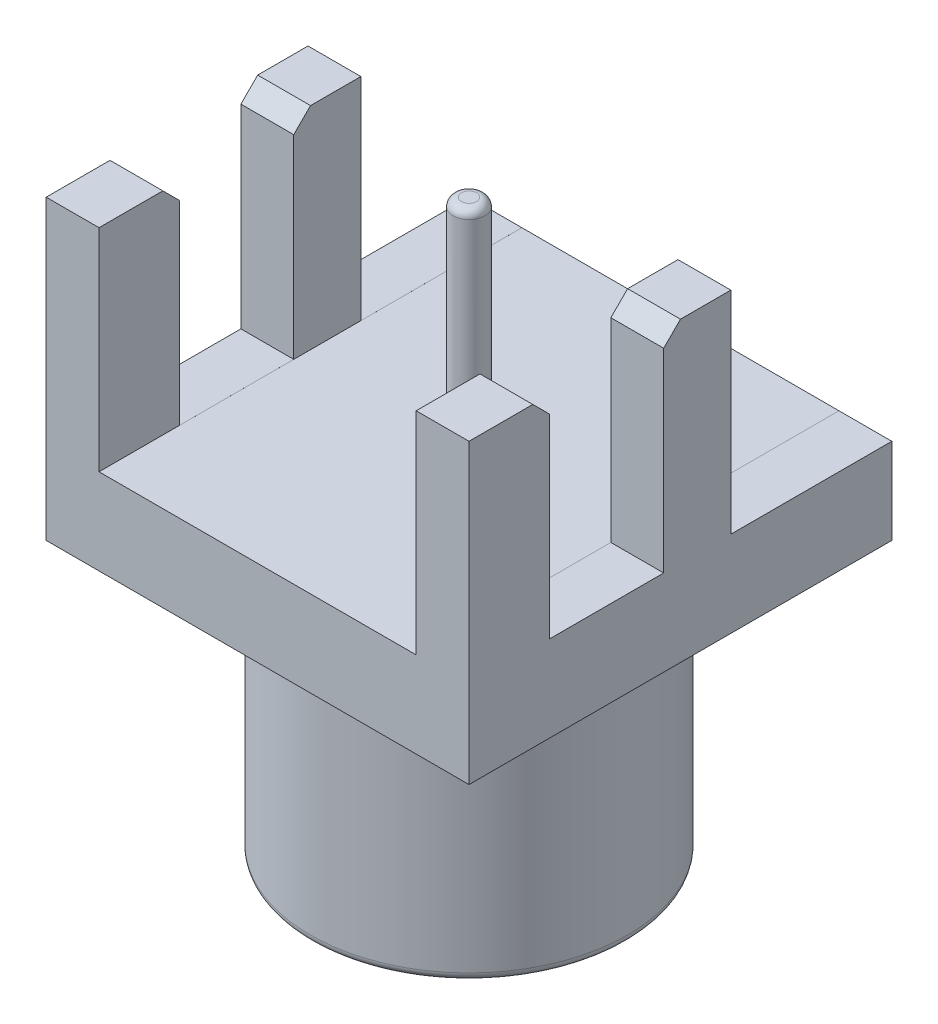
ISO-10303-21;
HEADER;
FILE_DESCRIPTION(('STEP AP214'),'2;1');
FILE_NAME('part.step','',(''),(''),'','','');
FILE_SCHEMA(('AUTOMOTIVE_DESIGN { 1 0 10303 214 1 1 1 1 }'));
ENDSEC;
DATA;
#1=APPLICATION_CONTEXT('core data for automotive mechanical design processes');
#2=APPLICATION_PROTOCOL_DEFINITION('international standard','automotive_design',2000,#1);
#3=PRODUCT_CONTEXT('',#1,'mechanical');
#4=PRODUCT('Part','Part','',(#3));
#5=PRODUCT_RELATED_PRODUCT_CATEGORY('part','',(#4));
#6=PRODUCT_DEFINITION_FORMATION('','',#4);
#7=PRODUCT_DEFINITION_CONTEXT('part definition',#1,'design');
#8=PRODUCT_DEFINITION('design','',#6,#7);
#9=PRODUCT_DEFINITION_SHAPE('','',#8);
#10=(LENGTH_UNIT() NAMED_UNIT(*) SI_UNIT(.MILLI.,.METRE.));
#11=(NAMED_UNIT(*) PLANE_ANGLE_UNIT() SI_UNIT($,.RADIAN.));
#12=(NAMED_UNIT(*) SI_UNIT($,.STERADIAN.) SOLID_ANGLE_UNIT());
#13=UNCERTAINTY_MEASURE_WITH_UNIT(LENGTH_MEASURE(1.E-05),#10,'distance_accuracy_value','');
#14=(GEOMETRIC_REPRESENTATION_CONTEXT(3) GLOBAL_UNCERTAINTY_ASSIGNED_CONTEXT((#13)) GLOBAL_UNIT_ASSIGNED_CONTEXT((#10,
#11,#12)) REPRESENTATION_CONTEXT('',''));
#15=CARTESIAN_POINT('',(0.,0.,0.));
#16=DIRECTION('',(0.,0.,1.));
#17=DIRECTION('',(1.,0.,0.));
#18=AXIS2_PLACEMENT_3D('',#15,#16,#17);
#19=CARTESIAN_POINT('',(0.,-4.1,0.));
#20=DIRECTION('',(0.,1.,0.));
#21=DIRECTION('',(0.,0.,1.));
#22=AXIS2_PLACEMENT_3D('',#19,#20,#21);
#23=CYLINDRICAL_SURFACE('',#22,0.381);
#24=CARTESIAN_POINT('',(0.,0.,0.));
#25=DIRECTION('',(0.,-1.,0.));
#26=DIRECTION('',(0.,0.,-1.));
#27=AXIS2_PLACEMENT_3D('',#24,#25,#26);
#28=CIRCLE('',#27,0.381);
#29=CARTESIAN_POINT('',(0.,0.,-0.381));
#30=VERTEX_POINT('',#29);
#31=EDGE_CURVE('E790',#30,#30,#28,.T.);
#32=ORIENTED_EDGE('',*,*,#31,.T.);
#33=EDGE_LOOP('',(#32));
#34=FACE_BOUND('',#33,.T.);
#35=CARTESIAN_POINT('',(0.,-2.576,0.));
#36=DIRECTION('',(0.,-1.,0.));
#37=DIRECTION('',(0.,0.,-1.));
#38=AXIS2_PLACEMENT_3D('',#35,#36,#37);
#39=CIRCLE('',#38,0.381);
#40=CARTESIAN_POINT('',(0.,-2.576,-0.381));
#41=VERTEX_POINT('',#40);
#42=EDGE_CURVE('E789',#41,#41,#39,.T.);
#43=ORIENTED_EDGE('',*,*,#42,.F.);
#44=EDGE_LOOP('',(#43));
#45=FACE_BOUND('',#44,.T.);
#46=ADVANCED_FACE('F41',(#34,#45),#23,.T.);
#47=CARTESIAN_POINT('',(0.,1.3001,0.));
#48=DIRECTION('',(0.,-1.,0.));
#49=DIRECTION('',(0.,0.,-1.));
#50=AXIS2_PLACEMENT_3D('',#47,#48,#49);
#51=PLANE('',#50);
#52=DIRECTION('',(-1.,0.,0.));
#53=VECTOR('',#52,1.);
#54=CARTESIAN_POINT('',(3.2,1.3001,1.98));
#55=LINE('',#54,#53);
#56=CARTESIAN_POINT('',(3.2,1.3001,1.98));
#57=VERTEX_POINT('',#56);
#58=CARTESIAN_POINT('',(2.4,1.3001,1.98));
#59=VERTEX_POINT('',#58);
#60=EDGE_CURVE('E230',#57,#59,#55,.T.);
#61=ORIENTED_EDGE('',*,*,#60,.F.);
#62=DIRECTION('',(0.,0.,-1.));
#63=VECTOR('',#62,1.);
#64=CARTESIAN_POINT('',(3.2,1.3001,-3.2));
#65=LINE('',#64,#63);
#66=CARTESIAN_POINT('',(3.2,1.3001,0.252799999999999));
#67=VERTEX_POINT('',#66);
#68=EDGE_CURVE('E307',#57,#67,#65,.T.);
#69=ORIENTED_EDGE('',*,*,#68,.T.);
#70=DIRECTION('',(1.,0.,0.));
#71=VECTOR('',#70,1.);
#72=CARTESIAN_POINT('',(3.2,1.3001,0.252799999999999));
#73=LINE('',#72,#71);
#74=CARTESIAN_POINT('',(2.4,1.3001,0.252799999999998));
#75=VERTEX_POINT('',#74);
#76=EDGE_CURVE('E249',#75,#67,#73,.T.);
#77=ORIENTED_EDGE('',*,*,#76,.F.);
#78=DIRECTION('',(0.,0.,1.));
#79=VECTOR('',#78,1.);
#80=CARTESIAN_POINT('',(2.4,1.3001,-3.2));
#81=LINE('',#80,#79);
#82=EDGE_CURVE('E313',#75,#59,#81,.T.);
#83=ORIENTED_EDGE('',*,*,#82,.T.);
#84=EDGE_LOOP('',(#61,#69,#77,#83));
#85=FACE_BOUND('',#84,.T.);
#86=ADVANCED_FACE('F422',(#85),#51,.F.);
#87=DIRECTION('',(-1.,0.,0.));
#88=VECTOR('',#87,1.);
#89=CARTESIAN_POINT('',(3.2,1.3001,-0.763200000000001));
#90=LINE('',#89,#88);
#91=CARTESIAN_POINT('',(3.2,1.3001,-0.763200000000001));
#92=VERTEX_POINT('',#91);
#93=CARTESIAN_POINT('',(2.4,1.3001,-0.763200000000001));
#94=VERTEX_POINT('',#93);
#95=EDGE_CURVE('E244',#92,#94,#90,.T.);
#96=ORIENTED_EDGE('',*,*,#95,.F.);
#97=CARTESIAN_POINT('',(3.2,1.3001,-3.2));
#98=VERTEX_POINT('',#97);
#99=EDGE_CURVE('E311',#92,#98,#65,.T.);
#100=ORIENTED_EDGE('',*,*,#99,.T.);
#101=DIRECTION('',(-1.,0.,0.));
#102=VECTOR('',#101,1.);
#103=CARTESIAN_POINT('',(3.2,1.3001,-3.2));
#104=LINE('',#103,#102);
#105=CARTESIAN_POINT('',(2.4,1.3001,-3.2));
#106=VERTEX_POINT('',#105);
#107=EDGE_CURVE('E310',#98,#106,#104,.T.);
#108=ORIENTED_EDGE('',*,*,#107,.T.);
#109=EDGE_CURVE('E314',#106,#94,#81,.T.);
#110=ORIENTED_EDGE('',*,*,#109,.T.);
#111=EDGE_LOOP('',(#96,#100,#108,#110));
#112=FACE_BOUND('',#111,.T.);
#113=ADVANCED_FACE('F428',(#112),#51,.F.);
#114=CARTESIAN_POINT('',(0.,1.3001,0.));
#115=DIRECTION('',(0.,1.,0.));
#116=DIRECTION('',(0.,0.,1.));
#117=AXIS2_PLACEMENT_3D('',#114,#115,#116);
#118=PLANE('',#117);
#119=DIRECTION('',(0.,0.,-1.));
#120=VECTOR('',#119,1.);
#121=CARTESIAN_POINT('',(-2.4,1.3001,-3.2));
#122=LINE('',#121,#120);
#123=CARTESIAN_POINT('',(-2.4,1.3001,1.98));
#124=VERTEX_POINT('',#123);
#125=CARTESIAN_POINT('',(-2.4,1.3001,0.2528));
#126=VERTEX_POINT('',#125);
#127=EDGE_CURVE('E328',#124,#126,#122,.T.);
#128=ORIENTED_EDGE('',*,*,#127,.T.);
#129=DIRECTION('',(1.,0.,0.));
#130=VECTOR('',#129,1.);
#131=CARTESIAN_POINT('',(-3.2,1.3001,0.2528));
#132=LINE('',#131,#130);
#133=CARTESIAN_POINT('',(-3.2,1.3001,0.2528));
#134=VERTEX_POINT('',#133);
#135=EDGE_CURVE('E268',#134,#126,#132,.T.);
#136=ORIENTED_EDGE('',*,*,#135,.F.);
#137=DIRECTION('',(0.,0.,1.));
#138=VECTOR('',#137,1.);
#139=CARTESIAN_POINT('',(-3.2,1.3001,-3.2));
#140=LINE('',#139,#138);
#141=CARTESIAN_POINT('',(-3.2,1.3001,1.98));
#142=VERTEX_POINT('',#141);
#143=EDGE_CURVE('E327',#134,#142,#140,.T.);
#144=ORIENTED_EDGE('',*,*,#143,.T.);
#145=DIRECTION('',(-1.,0.,0.));
#146=VECTOR('',#145,1.);
#147=CARTESIAN_POINT('',(-3.2,1.3001,1.98));
#148=LINE('',#147,#146);
#149=EDGE_CURVE('E291',#124,#142,#148,.T.);
#150=ORIENTED_EDGE('',*,*,#149,.F.);
#151=EDGE_LOOP('',(#128,#136,#144,#150));
#152=FACE_BOUND('',#151,.T.);
#153=ADVANCED_FACE('F499',(#152),#118,.T.);
#154=CARTESIAN_POINT('',(-3.2,1.3001,-3.2));
#155=VERTEX_POINT('',#154);
#156=CARTESIAN_POINT('',(-3.2,1.3001,-0.7632));
#157=VERTEX_POINT('',#156);
#158=EDGE_CURVE('E324',#155,#157,#140,.T.);
#159=ORIENTED_EDGE('',*,*,#158,.T.);
#160=DIRECTION('',(-1.,0.,0.));
#161=VECTOR('',#160,1.);
#162=CARTESIAN_POINT('',(-3.2,1.3001,-0.7632));
#163=LINE('',#162,#161);
#164=CARTESIAN_POINT('',(-2.4,1.3001,-0.7632));
#165=VERTEX_POINT('',#164);
#166=EDGE_CURVE('E273',#165,#157,#163,.T.);
#167=ORIENTED_EDGE('',*,*,#166,.F.);
#168=CARTESIAN_POINT('',(-2.4,1.3001,-3.2));
#169=VERTEX_POINT('',#168);
#170=EDGE_CURVE('E326',#165,#169,#122,.T.);
#171=ORIENTED_EDGE('',*,*,#170,.T.);
#172=DIRECTION('',(-1.,0.,0.));
#173=VECTOR('',#172,1.);
#174=CARTESIAN_POINT('',(-3.2,1.3001,-3.2));
#175=LINE('',#174,#173);
#176=EDGE_CURVE('E331',#169,#155,#175,.T.);
#177=ORIENTED_EDGE('',*,*,#176,.T.);
#178=EDGE_LOOP('',(#159,#167,#171,#177));
#179=FACE_BOUND('',#178,.T.);
#180=ADVANCED_FACE('F507',(#179),#118,.T.);
#181=CARTESIAN_POINT('',(0.,1.3,0.));
#182=DIRECTION('',(0.,-1.,0.));
#183=DIRECTION('',(0.,0.,-1.));
#184=AXIS2_PLACEMENT_3D('',#181,#182,#183);
#185=PLANE('',#184);
#186=CARTESIAN_POINT('',(0.,1.3,0.));
#187=DIRECTION('',(0.,-1.,0.));
#188=DIRECTION('',(0.,0.,-1.));
#189=AXIS2_PLACEMENT_3D('',#186,#187,#188);
#190=CIRCLE('',#189,0.24);
#191=CARTESIAN_POINT('',(0.,1.3,-0.24));
#192=VERTEX_POINT('',#191);
#193=EDGE_CURVE('E389',#192,#192,#190,.F.);
#194=ORIENTED_EDGE('',*,*,#193,.F.);
#195=EDGE_LOOP('',(#194));
#196=FACE_BOUND('',#195,.T.);
#197=DIRECTION('',(0.,0.,1.));
#198=VECTOR('',#197,1.);
#199=CARTESIAN_POINT('',(2.4,1.3,-3.2));
#200=LINE('',#199,#198);
#201=CARTESIAN_POINT('',(2.4,1.3,-3.2));
#202=VERTEX_POINT('',#201);
#203=CARTESIAN_POINT('',(2.4,1.3,3.2));
#204=VERTEX_POINT('',#203);
#205=EDGE_CURVE('E306',#202,#204,#200,.T.);
#206=ORIENTED_EDGE('',*,*,#205,.F.);
#207=DIRECTION('',(-1.,0.,0.));
#208=VECTOR('',#207,1.);
#209=CARTESIAN_POINT('',(-3.2,1.3,-3.2));
#210=LINE('',#209,#208);
#211=CARTESIAN_POINT('',(-2.4,1.3,-3.2));
#212=VERTEX_POINT('',#211);
#213=EDGE_CURVE('E354',#202,#212,#210,.T.);
#214=ORIENTED_EDGE('',*,*,#213,.T.);
#215=DIRECTION('',(0.,0.,-1.));
#216=VECTOR('',#215,1.);
#217=CARTESIAN_POINT('',(-2.4,1.3,-3.2));
#218=LINE('',#217,#216);
#219=CARTESIAN_POINT('',(-2.4,1.3,3.2));
#220=VERTEX_POINT('',#219);
#221=EDGE_CURVE('E323',#220,#212,#218,.T.);
#222=ORIENTED_EDGE('',*,*,#221,.F.);
#223=DIRECTION('',(1.,0.,0.));
#224=VECTOR('',#223,1.);
#225=CARTESIAN_POINT('',(-3.2,1.3,3.2));
#226=LINE('',#225,#224);
#227=EDGE_CURVE('E214',#220,#204,#226,.T.);
#228=ORIENTED_EDGE('',*,*,#227,.T.);
#229=EDGE_LOOP('',(#206,#214,#222,#228));
#230=FACE_BOUND('',#229,.T.);
#231=ADVANCED_FACE('F513',(#196,#230),#185,.F.);
#232=CARTESIAN_POINT('',(3.2,1.3,3.2));
#233=DIRECTION('',(-1.,0.,0.));
#234=DIRECTION('',(0.,0.,1.));
#235=AXIS2_PLACEMENT_3D('',#232,#233,#234);
#236=PLANE('',#235);
#237=DIRECTION('',(0.,-1.,0.));
#238=VECTOR('',#237,1.);
#239=CARTESIAN_POINT('',(3.2,4.5001,1.98));
#240=LINE('',#239,#238);
#241=CARTESIAN_POINT('',(3.2,4.2461,1.98));
#242=VERTEX_POINT('',#241);
#243=EDGE_CURVE('E242',#242,#57,#240,.T.);
#244=ORIENTED_EDGE('',*,*,#243,.F.);
#245=DIRECTION('',(0.,-0.707106781186549,-0.707106781186546));
#246=VECTOR('',#245,1.);
#247=CARTESIAN_POINT('',(3.2,4.5001,2.234));
#248=LINE('',#247,#246);
#249=CARTESIAN_POINT('',(3.2,4.5001,2.234));
#250=VERTEX_POINT('',#249);
#251=EDGE_CURVE('E221',#242,#250,#248,.F.);
#252=ORIENTED_EDGE('',*,*,#251,.T.);
#253=DIRECTION('',(0.,0.,-1.));
#254=VECTOR('',#253,1.);
#255=CARTESIAN_POINT('',(3.2,4.5001,3.2));
#256=LINE('',#255,#254);
#257=CARTESIAN_POINT('',(3.2,4.5001,3.2));
#258=VERTEX_POINT('',#257);
#259=EDGE_CURVE('E217',#258,#250,#256,.T.);
#260=ORIENTED_EDGE('',*,*,#259,.F.);
#261=DIRECTION('',(0.,-1.,0.));
#262=VECTOR('',#261,1.);
#263=CARTESIAN_POINT('',(3.2,1.3,3.2));
#264=LINE('',#263,#262);
#265=CARTESIAN_POINT('',(3.2,0.,3.2));
#266=VERTEX_POINT('',#265);
#267=EDGE_CURVE('E202',#258,#266,#264,.T.);
#268=ORIENTED_EDGE('',*,*,#267,.T.);
#269=DIRECTION('',(0.,0.,-1.));
#270=VECTOR('',#269,1.);
#271=CARTESIAN_POINT('',(3.2,0.,3.2));
#272=LINE('',#271,#270);
#273=CARTESIAN_POINT('',(3.2,0.,-3.2));
#274=VERTEX_POINT('',#273);
#275=EDGE_CURVE('E351',#266,#274,#272,.T.);
#276=ORIENTED_EDGE('',*,*,#275,.T.);
#277=DIRECTION('',(0.,-1.,0.));
#278=VECTOR('',#277,1.);
#279=CARTESIAN_POINT('',(3.2,1.3,-3.2));
#280=LINE('',#279,#278);
#281=EDGE_CURVE('E360',#98,#274,#280,.T.);
#282=ORIENTED_EDGE('',*,*,#281,.F.);
#283=ORIENTED_EDGE('',*,*,#99,.F.);
#284=DIRECTION('',(0.,-1.,0.));
#285=VECTOR('',#284,1.);
#286=CARTESIAN_POINT('',(3.2,4.5001,-0.763200000000001));
#287=LINE('',#286,#285);
#288=CARTESIAN_POINT('',(3.2,4.5001,-0.763200000000001));
#289=VERTEX_POINT('',#288);
#290=EDGE_CURVE('E254',#289,#92,#287,.T.);
#291=ORIENTED_EDGE('',*,*,#290,.F.);
#292=DIRECTION('',(0.,0.,-1.));
#293=VECTOR('',#292,1.);
#294=CARTESIAN_POINT('',(3.2,4.5001,-0.763200000000001));
#295=LINE('',#294,#293);
#296=CARTESIAN_POINT('',(3.2,4.5001,-0.00120000000000128));
#297=VERTEX_POINT('',#296);
#298=EDGE_CURVE('E252',#297,#289,#295,.T.);
#299=ORIENTED_EDGE('',*,*,#298,.F.);
#300=DIRECTION('',(0.,-0.707106781186549,0.707106781186546));
#301=VECTOR('',#300,1.);
#302=CARTESIAN_POINT('',(3.2,4.5001,-0.00120000000000111));
#303=LINE('',#302,#301);
#304=CARTESIAN_POINT('',(3.2,4.2461,0.252799999999999));
#305=VERTEX_POINT('',#304);
#306=EDGE_CURVE('E56',#297,#305,#303,.T.);
#307=ORIENTED_EDGE('',*,*,#306,.T.);
#308=DIRECTION('',(0.,-1.,0.));
#309=VECTOR('',#308,1.);
#310=CARTESIAN_POINT('',(3.2,4.5001,0.252799999999999));
#311=LINE('',#310,#309);
#312=EDGE_CURVE('E261',#305,#67,#311,.T.);
#313=ORIENTED_EDGE('',*,*,#312,.T.);
#314=ORIENTED_EDGE('',*,*,#68,.F.);
#315=EDGE_LOOP('',(#244,#252,#260,#268,#276,#282,#283,#291,#299,#307,#313,#314));
#316=FACE_BOUND('',#315,.T.);
#317=ADVANCED_FACE('F219',(#316),#236,.F.);
#318=CARTESIAN_POINT('',(-3.2,1.3,-3.2));
#319=DIRECTION('',(0.,0.,1.));
#320=DIRECTION('',(1.,0.,0.));
#321=AXIS2_PLACEMENT_3D('',#318,#319,#320);
#322=PLANE('',#321);
#323=DIRECTION('',(-1.,0.,0.));
#324=VECTOR('',#323,1.);
#325=CARTESIAN_POINT('',(-3.2,0.,-3.2));
#326=LINE('',#325,#324);
#327=CARTESIAN_POINT('',(-3.2,0.,-3.2));
#328=VERTEX_POINT('',#327);
#329=EDGE_CURVE('E566',#274,#328,#326,.T.);
#330=ORIENTED_EDGE('',*,*,#329,.T.);
#331=DIRECTION('',(0.,-1.,0.));
#332=VECTOR('',#331,1.);
#333=CARTESIAN_POINT('',(-3.2,1.3,-3.2));
#334=LINE('',#333,#332);
#335=EDGE_CURVE('E568',#155,#328,#334,.T.);
#336=ORIENTED_EDGE('',*,*,#335,.F.);
#337=ORIENTED_EDGE('',*,*,#176,.F.);
#338=DIRECTION('',(0.,-1.,0.));
#339=VECTOR('',#338,1.);
#340=CARTESIAN_POINT('',(-2.4,1.3001,-3.2));
#341=LINE('',#340,#339);
#342=EDGE_CURVE('E334',#169,#212,#341,.T.);
#343=ORIENTED_EDGE('',*,*,#342,.T.);
#344=ORIENTED_EDGE('',*,*,#213,.F.);
#345=DIRECTION('',(0.,-1.,0.));
#346=VECTOR('',#345,1.);
#347=CARTESIAN_POINT('',(2.4,1.3001,-3.2));
#348=LINE('',#347,#346);
#349=EDGE_CURVE('E320',#106,#202,#348,.T.);
#350=ORIENTED_EDGE('',*,*,#349,.F.);
#351=ORIENTED_EDGE('',*,*,#107,.F.);
#352=ORIENTED_EDGE('',*,*,#281,.T.);
#353=EDGE_LOOP('',(#330,#336,#337,#343,#344,#350,#351,#352));
#354=FACE_BOUND('',#353,.T.);
#355=ADVANCED_FACE('F525',(#354),#322,.F.);
#356=CARTESIAN_POINT('',(-3.2,1.3,3.2));
#357=DIRECTION('',(1.,0.,0.));
#358=DIRECTION('',(0.,0.,-1.));
#359=AXIS2_PLACEMENT_3D('',#356,#357,#358);
#360=PLANE('',#359);
#361=DIRECTION('',(0.,0.,1.));
#362=VECTOR('',#361,1.);
#363=CARTESIAN_POINT('',(-3.2,4.5001,3.2));
#364=LINE('',#363,#362);
#365=CARTESIAN_POINT('',(-3.2,4.5001,2.234));
#366=VERTEX_POINT('',#365);
#367=CARTESIAN_POINT('',(-3.2,4.5001,3.2));
#368=VERTEX_POINT('',#367);
#369=EDGE_CURVE('E292',#366,#368,#364,.T.);
#370=ORIENTED_EDGE('',*,*,#369,.F.);
#371=DIRECTION('',(0.,0.707106781186549,0.707106781186546));
#372=VECTOR('',#371,1.);
#373=CARTESIAN_POINT('',(-3.2,4.5001,2.234));
#374=LINE('',#373,#372);
#375=CARTESIAN_POINT('',(-3.2,4.2461,1.98));
#376=VERTEX_POINT('',#375);
#377=EDGE_CURVE('E362',#366,#376,#374,.F.);
#378=ORIENTED_EDGE('',*,*,#377,.T.);
#379=DIRECTION('',(0.,-1.,0.));
#380=VECTOR('',#379,1.);
#381=CARTESIAN_POINT('',(-3.2,4.5001,1.98));
#382=LINE('',#381,#380);
#383=EDGE_CURVE('E300',#376,#142,#382,.T.);
#384=ORIENTED_EDGE('',*,*,#383,.T.);
#385=ORIENTED_EDGE('',*,*,#143,.F.);
#386=DIRECTION('',(0.,-1.,0.));
#387=VECTOR('',#386,1.);
#388=CARTESIAN_POINT('',(-3.2,4.5001,0.2528));
#389=LINE('',#388,#387);
#390=CARTESIAN_POINT('',(-3.2,4.2461,0.2528));
#391=VERTEX_POINT('',#390);
#392=EDGE_CURVE('E289',#391,#134,#389,.T.);
#393=ORIENTED_EDGE('',*,*,#392,.F.);
#394=DIRECTION('',(0.,0.707106781186549,-0.707106781186546));
#395=VECTOR('',#394,1.);
#396=CARTESIAN_POINT('',(-3.2,4.5001,-0.00120000000000057));
#397=LINE('',#396,#395);
#398=CARTESIAN_POINT('',(-3.2,4.5001,-0.00120000000000073));
#399=VERTEX_POINT('',#398);
#400=EDGE_CURVE('E359',#391,#399,#397,.T.);
#401=ORIENTED_EDGE('',*,*,#400,.T.);
#402=DIRECTION('',(0.,0.,1.));
#403=VECTOR('',#402,1.);
#404=CARTESIAN_POINT('',(-3.2,4.5001,-0.7632));
#405=LINE('',#404,#403);
#406=CARTESIAN_POINT('',(-3.2,4.5001,-0.7632));
#407=VERTEX_POINT('',#406);
#408=EDGE_CURVE('E269',#407,#399,#405,.T.);
#409=ORIENTED_EDGE('',*,*,#408,.F.);
#410=DIRECTION('',(0.,-1.,0.));
#411=VECTOR('',#410,1.);
#412=CARTESIAN_POINT('',(-3.2,4.5001,-0.7632));
#413=LINE('',#412,#411);
#414=EDGE_CURVE('E277',#407,#157,#413,.T.);
#415=ORIENTED_EDGE('',*,*,#414,.T.);
#416=ORIENTED_EDGE('',*,*,#158,.F.);
#417=ORIENTED_EDGE('',*,*,#335,.T.);
#418=DIRECTION('',(0.,0.,1.));
#419=VECTOR('',#418,1.);
#420=CARTESIAN_POINT('',(-3.2,0.,3.2));
#421=LINE('',#420,#419);
#422=CARTESIAN_POINT('',(-3.2,0.,3.2));
#423=VERTEX_POINT('',#422);
#424=EDGE_CURVE('E571',#328,#423,#421,.T.);
#425=ORIENTED_EDGE('',*,*,#424,.T.);
#426=DIRECTION('',(0.,-1.,0.));
#427=VECTOR('',#426,1.);
#428=CARTESIAN_POINT('',(-3.2,1.3,3.2));
#429=LINE('',#428,#427);
#430=EDGE_CURVE('E213',#368,#423,#429,.T.);
#431=ORIENTED_EDGE('',*,*,#430,.F.);
#432=EDGE_LOOP('',(#370,#378,#384,#385,#393,#401,#409,#415,#416,#417,#425,#431));
#433=FACE_BOUND('',#432,.T.);
#434=ADVANCED_FACE('F522',(#433),#360,.F.);
#435=CARTESIAN_POINT('',(-3.2,1.3,3.2));
#436=DIRECTION('',(0.,0.,-1.));
#437=DIRECTION('',(-1.,0.,0.));
#438=AXIS2_PLACEMENT_3D('',#435,#436,#437);
#439=PLANE('',#438);
#440=DIRECTION('',(1.,0.,0.));
#441=VECTOR('',#440,1.);
#442=CARTESIAN_POINT('',(-3.2,0.,3.2));
#443=LINE('',#442,#441);
#444=EDGE_CURVE('E210',#423,#266,#443,.T.);
#445=ORIENTED_EDGE('',*,*,#444,.T.);
#446=ORIENTED_EDGE('',*,*,#267,.F.);
#447=DIRECTION('',(1.,0.,0.));
#448=VECTOR('',#447,1.);
#449=CARTESIAN_POINT('',(3.2,4.5001,3.2));
#450=LINE('',#449,#448);
#451=CARTESIAN_POINT('',(2.4,4.5001,3.2));
#452=VERTEX_POINT('',#451);
#453=EDGE_CURVE('E207',#452,#258,#450,.T.);
#454=ORIENTED_EDGE('',*,*,#453,.F.);
#455=DIRECTION('',(0.,-1.,0.));
#456=VECTOR('',#455,1.);
#457=CARTESIAN_POINT('',(2.4,1.3001,3.2));
#458=LINE('',#457,#456);
#459=EDGE_CURVE('E316',#452,#204,#458,.T.);
#460=ORIENTED_EDGE('',*,*,#459,.T.);
#461=ORIENTED_EDGE('',*,*,#227,.F.);
#462=DIRECTION('',(0.,-1.,0.));
#463=VECTOR('',#462,1.);
#464=CARTESIAN_POINT('',(-2.4,1.3001,3.2));
#465=LINE('',#464,#463);
#466=CARTESIAN_POINT('',(-2.4,4.5001,3.2));
#467=VERTEX_POINT('',#466);
#468=EDGE_CURVE('E346',#467,#220,#465,.T.);
#469=ORIENTED_EDGE('',*,*,#468,.F.);
#470=DIRECTION('',(1.,0.,0.));
#471=VECTOR('',#470,1.);
#472=CARTESIAN_POINT('',(-3.2,4.5001,3.2));
#473=LINE('',#472,#471);
#474=EDGE_CURVE('E294',#368,#467,#473,.T.);
#475=ORIENTED_EDGE('',*,*,#474,.F.);
#476=ORIENTED_EDGE('',*,*,#430,.T.);
#477=EDGE_LOOP('',(#445,#446,#454,#460,#461,#469,#475,#476));
#478=FACE_BOUND('',#477,.T.);
#479=ADVANCED_FACE('F204',(#478),#439,.F.);
#480=CARTESIAN_POINT('',(0.,0.,0.));
#481=DIRECTION('',(0.,-1.,0.));
#482=DIRECTION('',(0.,0.,-1.));
#483=AXIS2_PLACEMENT_3D('',#480,#481,#482);
#484=PLANE('',#483);
#485=CARTESIAN_POINT('',(0.,0.,0.));
#486=DIRECTION('',(0.,-1.,0.));
#487=DIRECTION('',(0.,0.,-1.));
#488=AXIS2_PLACEMENT_3D('',#485,#486,#487);
#489=CIRCLE('',#488,2.4);
#490=CARTESIAN_POINT('',(0.,0.,-2.4));
#491=VERTEX_POINT('',#490);
#492=EDGE_CURVE('E236',#491,#491,#489,.T.);
#493=ORIENTED_EDGE('',*,*,#492,.F.);
#494=EDGE_LOOP('',(#493));
#495=FACE_BOUND('',#494,.T.);
#496=ORIENTED_EDGE('',*,*,#275,.F.);
#497=ORIENTED_EDGE('',*,*,#444,.F.);
#498=ORIENTED_EDGE('',*,*,#424,.F.);
#499=ORIENTED_EDGE('',*,*,#329,.F.);
#500=EDGE_LOOP('',(#496,#497,#498,#499));
#501=FACE_BOUND('',#500,.T.);
#502=ADVANCED_FACE('F511',(#495,#501),#484,.T.);
#503=CARTESIAN_POINT('',(-2.4,1.3001,-3.2));
#504=DIRECTION('',(-1.,0.,0.));
#505=DIRECTION('',(0.,0.,1.));
#506=AXIS2_PLACEMENT_3D('',#503,#504,#505);
#507=PLANE('',#506);
#508=DIRECTION('',(0.,-1.,0.));
#509=VECTOR('',#508,1.);
#510=CARTESIAN_POINT('',(-2.4,4.5001,1.98));
#511=LINE('',#510,#509);
#512=CARTESIAN_POINT('',(-2.4,4.2461,1.98));
#513=VERTEX_POINT('',#512);
#514=EDGE_CURVE('E304',#513,#124,#511,.T.);
#515=ORIENTED_EDGE('',*,*,#514,.F.);
#516=DIRECTION('',(0.,-0.707106781186549,-0.707106781186546));
#517=VECTOR('',#516,1.);
#518=CARTESIAN_POINT('',(-2.4,4.5001,2.234));
#519=LINE('',#518,#517);
#520=CARTESIAN_POINT('',(-2.4,4.5001,2.234));
#521=VERTEX_POINT('',#520);
#522=EDGE_CURVE('E368',#513,#521,#519,.F.);
#523=ORIENTED_EDGE('',*,*,#522,.T.);
#524=DIRECTION('',(0.,0.,-1.));
#525=VECTOR('',#524,1.);
#526=CARTESIAN_POINT('',(-2.4,4.5001,3.2));
#527=LINE('',#526,#525);
#528=EDGE_CURVE('E297',#467,#521,#527,.T.);
#529=ORIENTED_EDGE('',*,*,#528,.F.);
#530=ORIENTED_EDGE('',*,*,#468,.T.);
#531=ORIENTED_EDGE('',*,*,#221,.T.);
#532=ORIENTED_EDGE('',*,*,#342,.F.);
#533=ORIENTED_EDGE('',*,*,#170,.F.);
#534=DIRECTION('',(0.,-1.,0.));
#535=VECTOR('',#534,1.);
#536=CARTESIAN_POINT('',(-2.4,4.5001,-0.7632));
#537=LINE('',#536,#535);
#538=CARTESIAN_POINT('',(-2.4,4.5001,-0.7632));
#539=VERTEX_POINT('',#538);
#540=EDGE_CURVE('E284',#539,#165,#537,.T.);
#541=ORIENTED_EDGE('',*,*,#540,.F.);
#542=DIRECTION('',(0.,0.,-1.));
#543=VECTOR('',#542,1.);
#544=CARTESIAN_POINT('',(-2.4,4.5001,-0.7632));
#545=LINE('',#544,#543);
#546=CARTESIAN_POINT('',(-2.4,4.5001,-0.00120000000000062));
#547=VERTEX_POINT('',#546);
#548=EDGE_CURVE('E272',#547,#539,#545,.T.);
#549=ORIENTED_EDGE('',*,*,#548,.F.);
#550=DIRECTION('',(0.,-0.707106781186549,0.707106781186546));
#551=VECTOR('',#550,1.);
#552=CARTESIAN_POINT('',(-2.4,4.5001,-0.00120000000000044));
#553=LINE('',#552,#551);
#554=CARTESIAN_POINT('',(-2.4,4.2461,0.2528));
#555=VERTEX_POINT('',#554);
#556=EDGE_CURVE('E366',#547,#555,#553,.T.);
#557=ORIENTED_EDGE('',*,*,#556,.T.);
#558=DIRECTION('',(0.,-1.,0.));
#559=VECTOR('',#558,1.);
#560=CARTESIAN_POINT('',(-2.4,4.5001,0.2528));
#561=LINE('',#560,#559);
#562=EDGE_CURVE('E287',#555,#126,#561,.T.);
#563=ORIENTED_EDGE('',*,*,#562,.T.);
#564=ORIENTED_EDGE('',*,*,#127,.F.);
#565=EDGE_LOOP('',(#515,#523,#529,#530,#531,#532,#533,#541,#549,#557,#563,#564));
#566=FACE_BOUND('',#565,.T.);
#567=ADVANCED_FACE('F503',(#566),#507,.F.);
#568=CARTESIAN_POINT('',(2.4,1.3001,-3.2));
#569=DIRECTION('',(1.,0.,0.));
#570=DIRECTION('',(0.,0.,-1.));
#571=AXIS2_PLACEMENT_3D('',#568,#569,#570);
#572=PLANE('',#571);
#573=DIRECTION('',(0.,0.,1.));
#574=VECTOR('',#573,1.);
#575=CARTESIAN_POINT('',(2.4,4.5001,3.2));
#576=LINE('',#575,#574);
#577=CARTESIAN_POINT('',(2.4,4.5001,2.234));
#578=VERTEX_POINT('',#577);
#579=EDGE_CURVE('E225',#578,#452,#576,.T.);
#580=ORIENTED_EDGE('',*,*,#579,.F.);
#581=DIRECTION('',(0.,0.707106781186549,0.707106781186546));
#582=VECTOR('',#581,1.);
#583=CARTESIAN_POINT('',(2.4,4.5001,2.234));
#584=LINE('',#583,#582);
#585=CARTESIAN_POINT('',(2.4,4.2461,1.98));
#586=VERTEX_POINT('',#585);
#587=EDGE_CURVE('E374',#578,#586,#584,.F.);
#588=ORIENTED_EDGE('',*,*,#587,.T.);
#589=DIRECTION('',(0.,-1.,0.));
#590=VECTOR('',#589,1.);
#591=CARTESIAN_POINT('',(2.4,4.5001,1.98));
#592=LINE('',#591,#590);
#593=EDGE_CURVE('E239',#586,#59,#592,.T.);
#594=ORIENTED_EDGE('',*,*,#593,.T.);
#595=ORIENTED_EDGE('',*,*,#82,.F.);
#596=DIRECTION('',(0.,-1.,0.));
#597=VECTOR('',#596,1.);
#598=CARTESIAN_POINT('',(2.4,4.5001,0.252799999999999));
#599=LINE('',#598,#597);
#600=CARTESIAN_POINT('',(2.4,4.2461,0.252799999999999));
#601=VERTEX_POINT('',#600);
#602=EDGE_CURVE('E263',#601,#75,#599,.T.);
#603=ORIENTED_EDGE('',*,*,#602,.F.);
#604=DIRECTION('',(0.,0.707106781186549,-0.707106781186546));
#605=VECTOR('',#604,1.);
#606=CARTESIAN_POINT('',(2.4,4.5001,-0.00120000000000117));
#607=LINE('',#606,#605);
#608=CARTESIAN_POINT('',(2.4,4.5001,-0.00120000000000129));
#609=VERTEX_POINT('',#608);
#610=EDGE_CURVE('E372',#601,#609,#607,.T.);
#611=ORIENTED_EDGE('',*,*,#610,.T.);
#612=DIRECTION('',(0.,0.,1.));
#613=VECTOR('',#612,1.);
#614=CARTESIAN_POINT('',(2.4,4.5001,-0.763200000000001));
#615=LINE('',#614,#613);
#616=CARTESIAN_POINT('',(2.4,4.5001,-0.763200000000001));
#617=VERTEX_POINT('',#616);
#618=EDGE_CURVE('E248',#617,#609,#615,.T.);
#619=ORIENTED_EDGE('',*,*,#618,.F.);
#620=DIRECTION('',(0.,-1.,0.));
#621=VECTOR('',#620,1.);
#622=CARTESIAN_POINT('',(2.4,4.5001,-0.763200000000001));
#623=LINE('',#622,#621);
#624=EDGE_CURVE('E265',#617,#94,#623,.T.);
#625=ORIENTED_EDGE('',*,*,#624,.T.);
#626=ORIENTED_EDGE('',*,*,#109,.F.);
#627=ORIENTED_EDGE('',*,*,#349,.T.);
#628=ORIENTED_EDGE('',*,*,#205,.T.);
#629=ORIENTED_EDGE('',*,*,#459,.F.);
#630=EDGE_LOOP('',(#580,#588,#594,#595,#603,#611,#619,#625,#626,#627,#628,#629));
#631=FACE_BOUND('',#630,.T.);
#632=ADVANCED_FACE('F495',(#631),#572,.F.);
#633=CARTESIAN_POINT('',(-3.2,4.5001,1.98));
#634=DIRECTION('',(0.,0.,1.));
#635=DIRECTION('',(1.,0.,0.));
#636=AXIS2_PLACEMENT_3D('',#633,#634,#635);
#637=PLANE('',#636);
#638=ORIENTED_EDGE('',*,*,#383,.F.);
#639=DIRECTION('',(1.,0.,0.));
#640=VECTOR('',#639,1.);
#641=CARTESIAN_POINT('',(-3.2,4.2461,1.98));
#642=LINE('',#641,#640);
#643=EDGE_CURVE('E364',#376,#513,#642,.T.);
#644=ORIENTED_EDGE('',*,*,#643,.T.);
#645=ORIENTED_EDGE('',*,*,#514,.T.);
#646=ORIENTED_EDGE('',*,*,#149,.T.);
#647=EDGE_LOOP('',(#638,#644,#645,#646));
#648=FACE_BOUND('',#647,.T.);
#649=ADVANCED_FACE('F492',(#648),#637,.F.);
#650=CARTESIAN_POINT('',(0.,4.5001,0.));
#651=DIRECTION('',(0.,-1.,0.));
#652=DIRECTION('',(0.,0.,-1.));
#653=AXIS2_PLACEMENT_3D('',#650,#651,#652);
#654=PLANE('',#653);
#655=ORIENTED_EDGE('',*,*,#528,.T.);
#656=DIRECTION('',(-1.,0.,0.));
#657=VECTOR('',#656,1.);
#658=CARTESIAN_POINT('',(0.,4.5001,2.234));
#659=LINE('',#658,#657);
#660=EDGE_CURVE('E356',#521,#366,#659,.T.);
#661=ORIENTED_EDGE('',*,*,#660,.T.);
#662=ORIENTED_EDGE('',*,*,#369,.T.);
#663=ORIENTED_EDGE('',*,*,#474,.T.);
#664=EDGE_LOOP('',(#655,#661,#662,#663));
#665=FACE_BOUND('',#664,.T.);
#666=ADVANCED_FACE('F488',(#665),#654,.F.);
#667=CARTESIAN_POINT('',(-3.2,4.5001,0.2528));
#668=DIRECTION('',(0.,0.,-1.));
#669=DIRECTION('',(-1.,0.,0.));
#670=AXIS2_PLACEMENT_3D('',#667,#668,#669);
#671=PLANE('',#670);
#672=ORIENTED_EDGE('',*,*,#562,.F.);
#673=DIRECTION('',(-1.,0.,0.));
#674=VECTOR('',#673,1.);
#675=CARTESIAN_POINT('',(-3.2,4.2461,0.2528));
#676=LINE('',#675,#674);
#677=EDGE_CURVE('E387',#555,#391,#676,.T.);
#678=ORIENTED_EDGE('',*,*,#677,.T.);
#679=ORIENTED_EDGE('',*,*,#392,.T.);
#680=ORIENTED_EDGE('',*,*,#135,.T.);
#681=EDGE_LOOP('',(#672,#678,#679,#680));
#682=FACE_BOUND('',#681,.T.);
#683=ADVANCED_FACE('F484',(#682),#671,.F.);
#684=CARTESIAN_POINT('',(-3.2,4.5001,-0.7632));
#685=DIRECTION('',(0.,0.,1.));
#686=DIRECTION('',(1.,0.,0.));
#687=AXIS2_PLACEMENT_3D('',#684,#685,#686);
#688=PLANE('',#687);
#689=ORIENTED_EDGE('',*,*,#166,.T.);
#690=ORIENTED_EDGE('',*,*,#414,.F.);
#691=DIRECTION('',(-1.,0.,0.));
#692=VECTOR('',#691,1.);
#693=CARTESIAN_POINT('',(-3.2,4.5001,-0.7632));
#694=LINE('',#693,#692);
#695=EDGE_CURVE('E275',#539,#407,#694,.T.);
#696=ORIENTED_EDGE('',*,*,#695,.F.);
#697=ORIENTED_EDGE('',*,*,#540,.T.);
#698=EDGE_LOOP('',(#689,#690,#696,#697));
#699=FACE_BOUND('',#698,.T.);
#700=ADVANCED_FACE('F480',(#699),#688,.F.);
#701=CARTESIAN_POINT('',(0.,4.5001,0.));
#702=DIRECTION('',(0.,1.,0.));
#703=DIRECTION('',(0.,0.,1.));
#704=AXIS2_PLACEMENT_3D('',#701,#702,#703);
#705=PLANE('',#704);
#706=ORIENTED_EDGE('',*,*,#408,.T.);
#707=DIRECTION('',(1.,0.,0.));
#708=VECTOR('',#707,1.);
#709=CARTESIAN_POINT('',(-2.4,4.5001,-0.00120000000000068));
#710=LINE('',#709,#708);
#711=EDGE_CURVE('E384',#399,#547,#710,.T.);
#712=ORIENTED_EDGE('',*,*,#711,.T.);
#713=ORIENTED_EDGE('',*,*,#548,.T.);
#714=ORIENTED_EDGE('',*,*,#695,.T.);
#715=EDGE_LOOP('',(#706,#712,#713,#714));
#716=FACE_BOUND('',#715,.T.);
#717=ADVANCED_FACE('F476',(#716),#705,.T.);
#718=CARTESIAN_POINT('',(3.2,4.5001,-0.763200000000001));
#719=DIRECTION('',(0.,0.,1.));
#720=DIRECTION('',(1.,0.,0.));
#721=AXIS2_PLACEMENT_3D('',#718,#719,#720);
#722=PLANE('',#721);
#723=ORIENTED_EDGE('',*,*,#95,.T.);
#724=ORIENTED_EDGE('',*,*,#624,.F.);
#725=DIRECTION('',(-1.,0.,0.));
#726=VECTOR('',#725,1.);
#727=CARTESIAN_POINT('',(3.2,4.5001,-0.763200000000001));
#728=LINE('',#727,#726);
#729=EDGE_CURVE('E245',#289,#617,#728,.T.);
#730=ORIENTED_EDGE('',*,*,#729,.F.);
#731=ORIENTED_EDGE('',*,*,#290,.T.);
#732=EDGE_LOOP('',(#723,#724,#730,#731));
#733=FACE_BOUND('',#732,.T.);
#734=ADVANCED_FACE('F472',(#733),#722,.F.);
#735=CARTESIAN_POINT('',(3.2,4.5001,0.252799999999999));
#736=DIRECTION('',(0.,0.,-1.));
#737=DIRECTION('',(-1.,0.,0.));
#738=AXIS2_PLACEMENT_3D('',#735,#736,#737);
#739=PLANE('',#738);
#740=ORIENTED_EDGE('',*,*,#312,.F.);
#741=DIRECTION('',(-1.,0.,0.));
#742=VECTOR('',#741,1.);
#743=CARTESIAN_POINT('',(2.4,4.2461,0.252799999999999));
#744=LINE('',#743,#742);
#745=EDGE_CURVE('E382',#305,#601,#744,.T.);
#746=ORIENTED_EDGE('',*,*,#745,.T.);
#747=ORIENTED_EDGE('',*,*,#602,.T.);
#748=ORIENTED_EDGE('',*,*,#76,.T.);
#749=EDGE_LOOP('',(#740,#746,#747,#748));
#750=FACE_BOUND('',#749,.T.);
#751=ADVANCED_FACE('F468',(#750),#739,.F.);
#752=CARTESIAN_POINT('',(0.,4.5001,0.));
#753=DIRECTION('',(0.,1.,0.));
#754=DIRECTION('',(0.,0.,1.));
#755=AXIS2_PLACEMENT_3D('',#752,#753,#754);
#756=PLANE('',#755);
#757=ORIENTED_EDGE('',*,*,#618,.T.);
#758=DIRECTION('',(1.,0.,0.));
#759=VECTOR('',#758,1.);
#760=CARTESIAN_POINT('',(3.2,4.5001,-0.00120000000000155));
#761=LINE('',#760,#759);
#762=EDGE_CURVE('E380',#609,#297,#761,.T.);
#763=ORIENTED_EDGE('',*,*,#762,.T.);
#764=ORIENTED_EDGE('',*,*,#298,.T.);
#765=ORIENTED_EDGE('',*,*,#729,.T.);
#766=EDGE_LOOP('',(#757,#763,#764,#765));
#767=FACE_BOUND('',#766,.T.);
#768=ADVANCED_FACE('F464',(#767),#756,.T.);
#769=CARTESIAN_POINT('',(3.2,4.5001,1.98));
#770=DIRECTION('',(0.,0.,1.));
#771=DIRECTION('',(1.,0.,0.));
#772=AXIS2_PLACEMENT_3D('',#769,#770,#771);
#773=PLANE('',#772);
#774=ORIENTED_EDGE('',*,*,#593,.F.);
#775=DIRECTION('',(1.,0.,0.));
#776=VECTOR('',#775,1.);
#777=CARTESIAN_POINT('',(3.2,4.2461,1.98));
#778=LINE('',#777,#776);
#779=EDGE_CURVE('E376',#586,#242,#778,.T.);
#780=ORIENTED_EDGE('',*,*,#779,.T.);
#781=ORIENTED_EDGE('',*,*,#243,.T.);
#782=ORIENTED_EDGE('',*,*,#60,.T.);
#783=EDGE_LOOP('',(#774,#780,#781,#782));
#784=FACE_BOUND('',#783,.T.);
#785=ADVANCED_FACE('F461',(#784),#773,.F.);
#786=CARTESIAN_POINT('',(0.,4.5001,0.));
#787=DIRECTION('',(0.,-1.,0.));
#788=DIRECTION('',(0.,0.,-1.));
#789=AXIS2_PLACEMENT_3D('',#786,#787,#788);
#790=PLANE('',#789);
#791=ORIENTED_EDGE('',*,*,#259,.T.);
#792=DIRECTION('',(-1.,0.,0.));
#793=VECTOR('',#792,1.);
#794=CARTESIAN_POINT('',(0.,4.5001,2.234));
#795=LINE('',#794,#793);
#796=EDGE_CURVE('E370',#250,#578,#795,.T.);
#797=ORIENTED_EDGE('',*,*,#796,.T.);
#798=ORIENTED_EDGE('',*,*,#579,.T.);
#799=ORIENTED_EDGE('',*,*,#453,.T.);
#800=EDGE_LOOP('',(#791,#797,#798,#799));
#801=FACE_BOUND('',#800,.T.);
#802=ADVANCED_FACE('F227',(#801),#790,.F.);
#803=CARTESIAN_POINT('',(0.,4.5001,2.234));
#804=DIRECTION('',(0.,-0.707106781186546,0.707106781186549));
#805=DIRECTION('',(-1.,0.,0.));
#806=AXIS2_PLACEMENT_3D('',#803,#804,#805);
#807=PLANE('',#806);
#808=ORIENTED_EDGE('',*,*,#522,.F.);
#809=ORIENTED_EDGE('',*,*,#643,.F.);
#810=ORIENTED_EDGE('',*,*,#377,.F.);
#811=ORIENTED_EDGE('',*,*,#660,.F.);
#812=EDGE_LOOP('',(#808,#809,#810,#811));
#813=FACE_BOUND('',#812,.T.);
#814=ADVANCED_FACE('F460',(#813),#807,.F.);
#815=CARTESIAN_POINT('',(0.,4.5001,2.234));
#816=DIRECTION('',(0.,-0.707106781186546,0.707106781186549));
#817=DIRECTION('',(-1.,0.,0.));
#818=AXIS2_PLACEMENT_3D('',#815,#816,#817);
#819=PLANE('',#818);
#820=ORIENTED_EDGE('',*,*,#251,.F.);
#821=ORIENTED_EDGE('',*,*,#779,.F.);
#822=ORIENTED_EDGE('',*,*,#587,.F.);
#823=ORIENTED_EDGE('',*,*,#796,.F.);
#824=EDGE_LOOP('',(#820,#821,#822,#823));
#825=FACE_BOUND('',#824,.T.);
#826=ADVANCED_FACE('F534',(#825),#819,.F.);
#827=CARTESIAN_POINT('',(0.,4.5001,-0.00120000000000068));
#828=DIRECTION('',(0.,0.707106781186546,0.707106781186549));
#829=DIRECTION('',(-1.,0.,0.));
#830=AXIS2_PLACEMENT_3D('',#827,#828,#829);
#831=PLANE('',#830);
#832=ORIENTED_EDGE('',*,*,#610,.F.);
#833=ORIENTED_EDGE('',*,*,#745,.F.);
#834=ORIENTED_EDGE('',*,*,#306,.F.);
#835=ORIENTED_EDGE('',*,*,#762,.F.);
#836=EDGE_LOOP('',(#832,#833,#834,#835));
#837=FACE_BOUND('',#836,.T.);
#838=ADVANCED_FACE('F538',(#837),#831,.T.);
#839=CARTESIAN_POINT('',(0.,4.5001,-0.00120000000000035));
#840=DIRECTION('',(0.,0.707106781186546,0.707106781186549));
#841=DIRECTION('',(-1.,0.,0.));
#842=AXIS2_PLACEMENT_3D('',#839,#840,#841);
#843=PLANE('',#842);
#844=ORIENTED_EDGE('',*,*,#400,.F.);
#845=ORIENTED_EDGE('',*,*,#677,.F.);
#846=ORIENTED_EDGE('',*,*,#556,.F.);
#847=ORIENTED_EDGE('',*,*,#711,.F.);
#848=EDGE_LOOP('',(#844,#845,#846,#847));
#849=FACE_BOUND('',#848,.T.);
#850=ADVANCED_FACE('F453',(#849),#843,.T.);
#851=CARTESIAN_POINT('',(0.,5.17892250993909,0.));
#852=DIRECTION('',(0.,-1.,0.));
#853=DIRECTION('',(0.,0.,-1.));
#854=AXIS2_PLACEMENT_3D('',#851,#852,#853);
#855=CYLINDRICAL_SURFACE('',#854,0.24);
#856=CARTESIAN_POINT('',(0.,4.3751,0.));
#857=DIRECTION('',(0.,1.,0.));
#858=DIRECTION('',(0.,0.,1.));
#859=AXIS2_PLACEMENT_3D('',#856,#857,#858);
#860=CIRCLE('',#859,0.24);
#861=CARTESIAN_POINT('',(0.,4.3751,0.24));
#862=VERTEX_POINT('',#861);
#863=EDGE_CURVE('E395',#862,#862,#860,.F.);
#864=ORIENTED_EDGE('',*,*,#863,.T.);
#865=EDGE_LOOP('',(#864));
#866=FACE_BOUND('',#865,.T.);
#867=ORIENTED_EDGE('',*,*,#193,.T.);
#868=EDGE_LOOP('',(#867));
#869=FACE_BOUND('',#868,.T.);
#870=ADVANCED_FACE('F449',(#866,#869),#855,.T.);
#871=CARTESIAN_POINT('',(0.,4.5001,0.));
#872=DIRECTION('',(0.,1.,0.));
#873=DIRECTION('',(0.,0.,1.));
#874=AXIS2_PLACEMENT_3D('',#871,#872,#873);
#875=PLANE('',#874);
#876=CARTESIAN_POINT('',(0.,4.5001,0.));
#877=DIRECTION('',(0.,1.,0.));
#878=DIRECTION('',(0.,0.,1.));
#879=AXIS2_PLACEMENT_3D('',#876,#877,#878);
#880=CIRCLE('',#879,0.115);
#881=CARTESIAN_POINT('',(0.,4.5001,0.115));
#882=VERTEX_POINT('',#881);
#883=EDGE_CURVE('E392',#882,#882,#880,.T.);
#884=ORIENTED_EDGE('',*,*,#883,.T.);
#885=EDGE_LOOP('',(#884));
#886=FACE_BOUND('',#885,.T.);
#887=ADVANCED_FACE('F452',(#886),#875,.T.);
#888=CARTESIAN_POINT('',(0.,4.3751,0.));
#889=DIRECTION('',(0.,1.,0.));
#890=DIRECTION('',(0.,0.,1.));
#891=AXIS2_PLACEMENT_3D('',#888,#889,#890);
#892=DEGENERATE_TOROIDAL_SURFACE('',#891,0.115,0.125,.T.);
#893=ORIENTED_EDGE('',*,*,#863,.F.);
#894=EDGE_LOOP('',(#893));
#895=FACE_BOUND('',#894,.T.);
#896=ORIENTED_EDGE('',*,*,#883,.F.);
#897=EDGE_LOOP('',(#896));
#898=FACE_BOUND('',#897,.T.);
#899=ADVANCED_FACE('F447',(#895,#898),#892,.T.);
#900=CARTESIAN_POINT('',(0.,-4.1,0.));
#901=DIRECTION('',(0.,1.,0.));
#902=DIRECTION('',(0.,0.,1.));
#903=AXIS2_PLACEMENT_3D('',#900,#901,#902);
#904=CYLINDRICAL_SURFACE('',#903,2.0825);
#905=CARTESIAN_POINT('',(0.,-4.1,0.));
#906=DIRECTION('',(0.,-1.,0.));
#907=DIRECTION('',(0.,0.,-1.));
#908=AXIS2_PLACEMENT_3D('',#905,#906,#907);
#909=CIRCLE('',#908,2.0825);
#910=CARTESIAN_POINT('',(0.,-4.1,-2.0825));
#911=VERTEX_POINT('',#910);
#912=EDGE_CURVE('E233',#911,#911,#909,.T.);
#913=ORIENTED_EDGE('',*,*,#912,.T.);
#914=EDGE_LOOP('',(#913));
#915=FACE_BOUND('',#914,.T.);
#916=CARTESIAN_POINT('',(0.,0.,0.));
#917=DIRECTION('',(0.,-1.,0.));
#918=DIRECTION('',(0.,0.,-1.));
#919=AXIS2_PLACEMENT_3D('',#916,#917,#918);
#920=CIRCLE('',#919,2.0825);
#921=CARTESIAN_POINT('',(0.,0.,-2.0825));
#922=VERTEX_POINT('',#921);
#923=EDGE_CURVE('E398',#922,#922,#920,.F.);
#924=ORIENTED_EDGE('',*,*,#923,.T.);
#925=EDGE_LOOP('',(#924));
#926=FACE_BOUND('',#925,.T.);
#927=ADVANCED_FACE('F443',(#915,#926),#904,.F.);
#928=CARTESIAN_POINT('',(0.,-4.1,0.));
#929=DIRECTION('',(0.,1.,0.));
#930=DIRECTION('',(0.,0.,1.));
#931=AXIS2_PLACEMENT_3D('',#928,#929,#930);
#932=CYLINDRICAL_SURFACE('',#931,2.4);
#933=CARTESIAN_POINT('',(0.,-3.973,0.));
#934=DIRECTION('',(0.,-1.,0.));
#935=DIRECTION('',(0.,0.,-1.));
#936=AXIS2_PLACEMENT_3D('',#933,#934,#935);
#937=CIRCLE('',#936,2.4);
#938=CARTESIAN_POINT('',(0.,-3.973,-2.4));
#939=VERTEX_POINT('',#938);
#940=EDGE_CURVE('E12',#939,#939,#937,.F.);
#941=ORIENTED_EDGE('',*,*,#940,.T.);
#942=EDGE_LOOP('',(#941));
#943=FACE_BOUND('',#942,.T.);
#944=ORIENTED_EDGE('',*,*,#492,.T.);
#945=EDGE_LOOP('',(#944));
#946=FACE_BOUND('',#945,.T.);
#947=ADVANCED_FACE('F440',(#943,#946),#932,.T.);
#948=CARTESIAN_POINT('',(0.,-4.1,0.));
#949=DIRECTION('',(0.,-1.,0.));
#950=DIRECTION('',(0.,0.,-1.));
#951=AXIS2_PLACEMENT_3D('',#948,#949,#950);
#952=PLANE('',#951);
#953=CARTESIAN_POINT('',(0.,-4.1,0.));
#954=DIRECTION('',(0.,-1.,0.));
#955=DIRECTION('',(0.,0.,-1.));
#956=AXIS2_PLACEMENT_3D('',#953,#954,#955);
#957=CIRCLE('',#956,2.273);
#958=CARTESIAN_POINT('',(0.,-4.1,-2.273));
#959=VERTEX_POINT('',#958);
#960=EDGE_CURVE('E49',#959,#959,#957,.T.);
#961=ORIENTED_EDGE('',*,*,#960,.T.);
#962=EDGE_LOOP('',(#961));
#963=FACE_BOUND('',#962,.T.);
#964=ORIENTED_EDGE('',*,*,#912,.F.);
#965=EDGE_LOOP('',(#964));
#966=FACE_BOUND('',#965,.T.);
#967=ADVANCED_FACE('F409',(#963,#966),#952,.T.);
#968=ORIENTED_EDGE('',*,*,#31,.F.);
#969=EDGE_LOOP('',(#968));
#970=FACE_BOUND('',#969,.T.);
#971=ORIENTED_EDGE('',*,*,#923,.F.);
#972=EDGE_LOOP('',(#971));
#973=FACE_BOUND('',#972,.T.);
#974=ADVANCED_FACE('F439',(#970,#973),#484,.T.);
#975=CARTESIAN_POINT('',(0.,-2.576,0.));
#976=DIRECTION('',(0.,1.,0.));
#977=DIRECTION('',(0.,0.,-1.));
#978=AXIS2_PLACEMENT_3D('',#975,#976,#977);
#979=CONICAL_SURFACE('',#978,0.381,0.26179938779915);
#980=CARTESIAN_POINT('',(0.,-3.24387001872802,0.));
#981=DIRECTION('',(0.,1.,0.));
#982=DIRECTION('',(0.,0.,1.));
#983=AXIS2_PLACEMENT_3D('',#980,#981,#982);
#984=CIRCLE('',#983,0.202044767832868);
#985=CARTESIAN_POINT('',(0.,-3.24387001872802,0.202044767832868));
#986=VERTEX_POINT('',#985);
#987=EDGE_CURVE('E404',#986,#986,#984,.T.);
#988=ORIENTED_EDGE('',*,*,#987,.T.);
#989=EDGE_LOOP('',(#988));
#990=FACE_BOUND('',#989,.T.);
#991=ORIENTED_EDGE('',*,*,#42,.T.);
#992=EDGE_LOOP('',(#991));
#993=FACE_BOUND('',#992,.T.);
#994=ADVANCED_FACE('F435',(#990,#993),#979,.T.);
#995=CARTESIAN_POINT('',(0.,-3.338,0.));
#996=DIRECTION('',(0.,-1.,0.));
#997=DIRECTION('',(0.,0.,-1.));
#998=AXIS2_PLACEMENT_3D('',#995,#996,#997);
#999=PLANE('',#998);
#1000=CARTESIAN_POINT('',(0.,-3.338,0.));
#1001=DIRECTION('',(0.,-1.,0.));
#1002=DIRECTION('',(0.,0.,-1.));
#1003=AXIS2_PLACEMENT_3D('',#1000,#1001,#1002);
#1004=CIRCLE('',#1003,0.0793721878941561);
#1005=CARTESIAN_POINT('',(0.,-3.338,-0.0793721878941561));
#1006=VERTEX_POINT('',#1005);
#1007=EDGE_CURVE('E401',#1006,#1006,#1004,.T.);
#1008=ORIENTED_EDGE('',*,*,#1007,.T.);
#1009=EDGE_LOOP('',(#1008));
#1010=FACE_BOUND('',#1009,.T.);
#1011=ADVANCED_FACE('F418',(#1010),#999,.T.);
#1012=CARTESIAN_POINT('',(0.,-3.211,0.));
#1013=DIRECTION('',(0.,-1.,0.));
#1014=DIRECTION('',(0.,0.,-1.));
#1015=AXIS2_PLACEMENT_3D('',#1012,#1013,#1014);
#1016=DEGENERATE_TOROIDAL_SURFACE('',#1015,0.0793721878941561,0.127,.T.);
#1017=ORIENTED_EDGE('',*,*,#987,.F.);
#1018=EDGE_LOOP('',(#1017));
#1019=FACE_BOUND('',#1018,.T.);
#1020=ORIENTED_EDGE('',*,*,#1007,.F.);
#1021=EDGE_LOOP('',(#1020));
#1022=FACE_BOUND('',#1021,.T.);
#1023=ADVANCED_FACE('F413',(#1019,#1022),#1016,.T.);
#1024=CARTESIAN_POINT('',(0.,-3.973,0.));
#1025=DIRECTION('',(0.,-1.,0.));
#1026=DIRECTION('',(0.,0.,-1.));
#1027=AXIS2_PLACEMENT_3D('',#1024,#1025,#1026);
#1028=TOROIDAL_SURFACE('',#1027,2.273,0.127);
#1029=ORIENTED_EDGE('',*,*,#940,.F.);
#1030=EDGE_LOOP('',(#1029));
#1031=FACE_BOUND('',#1030,.T.);
#1032=ORIENTED_EDGE('',*,*,#960,.F.);
#1033=EDGE_LOOP('',(#1032));
#1034=FACE_BOUND('',#1033,.T.);
#1035=ADVANCED_FACE('F43',(#1031,#1034),#1028,.T.);
#1036=CLOSED_SHELL('',(#46,#86,#113,#153,#180,#231,#317,#355,#434,#479,#502,#567,#632,#649,#666,
#683,#700,#717,#734,#751,#768,#785,#802,#814,#826,#838,#850,#870,#887,#899,#927,#947,#967,#974,
#994,#1011,#1023,#1035));
#1037=MANIFOLD_SOLID_BREP('B2',#1036);
#1038=ADVANCED_BREP_SHAPE_REPRESENTATION('',(#18,#1037),#14);
#1039=SHAPE_DEFINITION_REPRESENTATION(#9,#1038);
ENDSEC;
END-ISO-10303-21;
